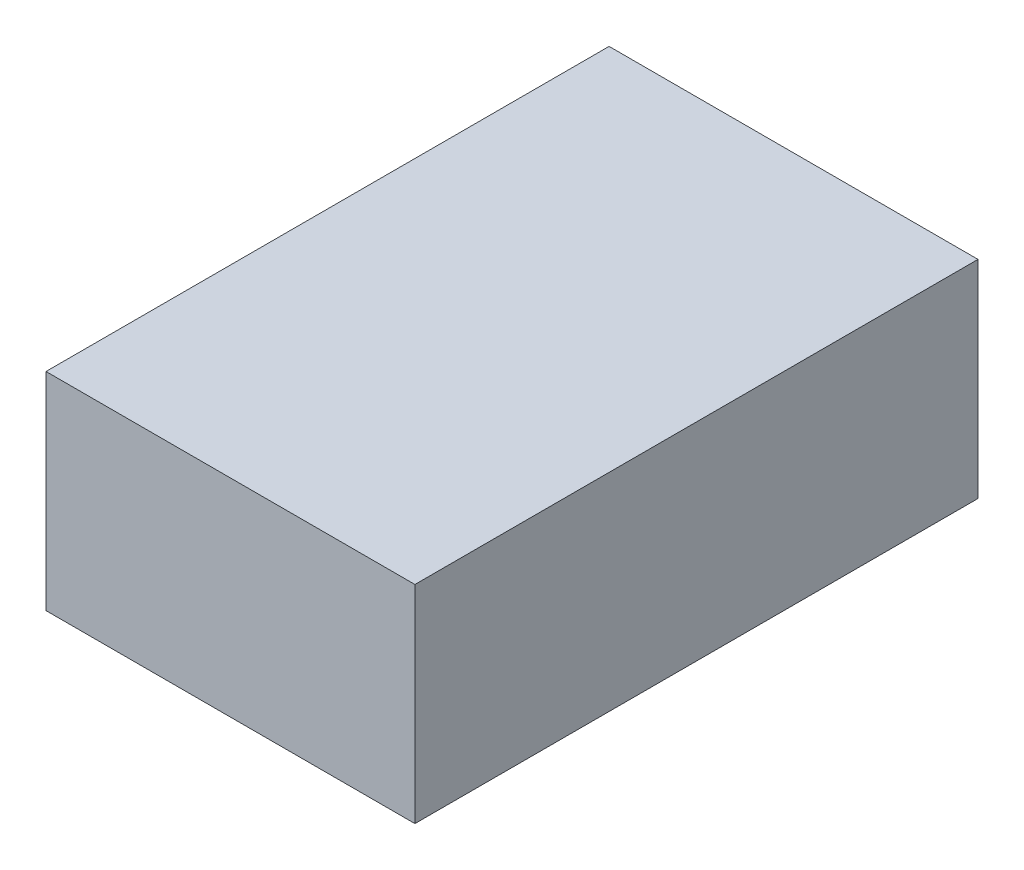
ISO-10303-21;
HEADER;
FILE_DESCRIPTION(('STEP AP214'),'2;1');
FILE_NAME('part.step','',(''),(''),'','','');
FILE_SCHEMA(('AUTOMOTIVE_DESIGN { 1 0 10303 214 1 1 1 1 }'));
ENDSEC;
DATA;
#1=APPLICATION_CONTEXT('core data for automotive mechanical design processes');
#2=APPLICATION_PROTOCOL_DEFINITION('international standard','automotive_design',2000,#1);
#3=PRODUCT_CONTEXT('',#1,'mechanical');
#4=PRODUCT('Part','Part','',(#3));
#5=PRODUCT_RELATED_PRODUCT_CATEGORY('part','',(#4));
#6=PRODUCT_DEFINITION_FORMATION('','',#4);
#7=PRODUCT_DEFINITION_CONTEXT('part definition',#1,'design');
#8=PRODUCT_DEFINITION('design','',#6,#7);
#9=PRODUCT_DEFINITION_SHAPE('','',#8);
#10=(LENGTH_UNIT() NAMED_UNIT(*) SI_UNIT(.MILLI.,.METRE.));
#11=(NAMED_UNIT(*) PLANE_ANGLE_UNIT() SI_UNIT($,.RADIAN.));
#12=(NAMED_UNIT(*) SI_UNIT($,.STERADIAN.) SOLID_ANGLE_UNIT());
#13=UNCERTAINTY_MEASURE_WITH_UNIT(LENGTH_MEASURE(1.E-05),#10,'distance_accuracy_value','');
#14=(GEOMETRIC_REPRESENTATION_CONTEXT(3) GLOBAL_UNCERTAINTY_ASSIGNED_CONTEXT((#13)) GLOBAL_UNIT_ASSIGNED_CONTEXT((#10,
#11,#12)) REPRESENTATION_CONTEXT('',''));
#15=CARTESIAN_POINT('',(0.,0.,0.));
#16=DIRECTION('',(0.,0.,1.));
#17=DIRECTION('',(1.,0.,0.));
#18=AXIS2_PLACEMENT_3D('',#15,#16,#17);
#19=CARTESIAN_POINT('',(180.43787804642,76.2,280.719307320076));
#20=DIRECTION('',(0.,0.,-1.));
#21=DIRECTION('',(-1.,0.,0.));
#22=AXIS2_PLACEMENT_3D('',#19,#20,#21);
#23=PLANE('',#22);
#24=DIRECTION('',(1.,0.,0.));
#25=VECTOR('',#24,1.);
#26=CARTESIAN_POINT('',(180.43787804642,-2.54,280.719307320076));
#27=LINE('',#26,#25);
#28=CARTESIAN_POINT('',(177.89787804642,-2.54,280.719307320076));
#29=VERTEX_POINT('',#28);
#30=CARTESIAN_POINT('',(322.67787804642,-2.54,280.719307320076));
#31=VERTEX_POINT('',#30);
#32=EDGE_CURVE('E196',#29,#31,#27,.T.);
#33=ORIENTED_EDGE('',*,*,#32,.T.);
#34=DIRECTION('',(0.,-1.,0.));
#35=VECTOR('',#34,1.);
#36=CARTESIAN_POINT('',(322.67787804642,76.2,280.719307320076));
#37=LINE('',#36,#35);
#38=CARTESIAN_POINT('',(322.67787804642,78.74,280.719307320076));
#39=VERTEX_POINT('',#38);
#40=EDGE_CURVE('E144',#39,#31,#37,.T.);
#41=ORIENTED_EDGE('',*,*,#40,.F.);
#42=DIRECTION('',(1.,0.,0.));
#43=VECTOR('',#42,1.);
#44=CARTESIAN_POINT('',(180.43787804642,78.74,280.719307320076));
#45=LINE('',#44,#43);
#46=CARTESIAN_POINT('',(177.89787804642,78.74,280.719307320076));
#47=VERTEX_POINT('',#46);
#48=EDGE_CURVE('E130',#47,#39,#45,.T.);
#49=ORIENTED_EDGE('',*,*,#48,.F.);
#50=DIRECTION('',(0.,-1.,0.));
#51=VECTOR('',#50,1.);
#52=CARTESIAN_POINT('',(177.89787804642,76.2,280.719307320076));
#53=LINE('',#52,#51);
#54=EDGE_CURVE('E104',#47,#29,#53,.T.);
#55=ORIENTED_EDGE('',*,*,#54,.T.);
#56=EDGE_LOOP('',(#33,#41,#49,#55));
#57=FACE_BOUND('',#56,.T.);
#58=ADVANCED_FACE('F44',(#57),#23,.F.);
#59=CARTESIAN_POINT('',(322.67787804642,76.2,278.179307320076));
#60=DIRECTION('',(-1.,0.,0.));
#61=DIRECTION('',(0.,0.,1.));
#62=AXIS2_PLACEMENT_3D('',#59,#60,#61);
#63=PLANE('',#62);
#64=DIRECTION('',(0.,0.,-1.));
#65=VECTOR('',#64,1.);
#66=CARTESIAN_POINT('',(322.67787804642,-2.54,278.179307320076));
#67=LINE('',#66,#65);
#68=CARTESIAN_POINT('',(322.67787804642,-2.54,59.7393073200764));
#69=VERTEX_POINT('',#68);
#70=EDGE_CURVE('E139',#31,#69,#67,.T.);
#71=ORIENTED_EDGE('',*,*,#70,.T.);
#72=DIRECTION('',(0.,-1.,0.));
#73=VECTOR('',#72,1.);
#74=CARTESIAN_POINT('',(322.67787804642,76.2,59.7393073200765));
#75=LINE('',#74,#73);
#76=CARTESIAN_POINT('',(322.67787804642,78.74,59.7393073200764));
#77=VERTEX_POINT('',#76);
#78=EDGE_CURVE('E137',#77,#69,#75,.T.);
#79=ORIENTED_EDGE('',*,*,#78,.F.);
#80=DIRECTION('',(0.,0.,-1.));
#81=VECTOR('',#80,1.);
#82=CARTESIAN_POINT('',(322.67787804642,78.74,278.179307320076));
#83=LINE('',#82,#81);
#84=EDGE_CURVE('E124',#39,#77,#83,.T.);
#85=ORIENTED_EDGE('',*,*,#84,.F.);
#86=ORIENTED_EDGE('',*,*,#40,.T.);
#87=EDGE_LOOP('',(#71,#79,#85,#86));
#88=FACE_BOUND('',#87,.T.);
#89=ADVANCED_FACE('F138',(#88),#63,.F.);
#90=CARTESIAN_POINT('',(180.43787804642,76.2,59.7393073200764));
#91=DIRECTION('',(0.,0.,-1.));
#92=DIRECTION('',(-1.,0.,0.));
#93=AXIS2_PLACEMENT_3D('',#90,#91,#92);
#94=PLANE('',#93);
#95=DIRECTION('',(1.,0.,0.));
#96=VECTOR('',#95,1.);
#97=CARTESIAN_POINT('',(180.43787804642,-2.54,59.7393073200764));
#98=LINE('',#97,#96);
#99=CARTESIAN_POINT('',(177.89787804642,-2.54,59.7393073200764));
#100=VERTEX_POINT('',#99);
#101=EDGE_CURVE('E160',#100,#69,#98,.T.);
#102=ORIENTED_EDGE('',*,*,#101,.F.);
#103=DIRECTION('',(0.,-1.,0.));
#104=VECTOR('',#103,1.);
#105=CARTESIAN_POINT('',(177.89787804642,76.2,59.7393073200764));
#106=LINE('',#105,#104);
#107=CARTESIAN_POINT('',(177.89787804642,78.74,59.7393073200764));
#108=VERTEX_POINT('',#107);
#109=EDGE_CURVE('E145',#108,#100,#106,.T.);
#110=ORIENTED_EDGE('',*,*,#109,.F.);
#111=DIRECTION('',(1.,0.,0.));
#112=VECTOR('',#111,1.);
#113=CARTESIAN_POINT('',(180.43787804642,78.74,59.7393073200764));
#114=LINE('',#113,#112);
#115=EDGE_CURVE('E129',#108,#77,#114,.T.);
#116=ORIENTED_EDGE('',*,*,#115,.T.);
#117=ORIENTED_EDGE('',*,*,#78,.T.);
#118=EDGE_LOOP('',(#102,#110,#116,#117));
#119=FACE_BOUND('',#118,.T.);
#120=ADVANCED_FACE('F147',(#119),#94,.T.);
#121=CARTESIAN_POINT('',(177.89787804642,76.2,278.179307320076));
#122=DIRECTION('',(-1.,0.,0.));
#123=DIRECTION('',(0.,0.,1.));
#124=AXIS2_PLACEMENT_3D('',#121,#122,#123);
#125=PLANE('',#124);
#126=DIRECTION('',(0.,0.,-1.));
#127=VECTOR('',#126,1.);
#128=CARTESIAN_POINT('',(177.89787804642,-2.54,278.179307320076));
#129=LINE('',#128,#127);
#130=EDGE_CURVE('E157',#29,#100,#129,.T.);
#131=ORIENTED_EDGE('',*,*,#130,.F.);
#132=ORIENTED_EDGE('',*,*,#54,.F.);
#133=DIRECTION('',(0.,0.,-1.));
#134=VECTOR('',#133,1.);
#135=CARTESIAN_POINT('',(177.89787804642,78.74,278.179307320076));
#136=LINE('',#135,#134);
#137=EDGE_CURVE('E150',#47,#108,#136,.T.);
#138=ORIENTED_EDGE('',*,*,#137,.T.);
#139=ORIENTED_EDGE('',*,*,#109,.T.);
#140=EDGE_LOOP('',(#131,#132,#138,#139));
#141=FACE_BOUND('',#140,.T.);
#142=ADVANCED_FACE('F208',(#141),#125,.T.);
#143=CARTESIAN_POINT('',(0.,78.74,0.));
#144=DIRECTION('',(0.,1.,0.));
#145=DIRECTION('',(0.,0.,1.));
#146=AXIS2_PLACEMENT_3D('',#143,#144,#145);
#147=PLANE('',#146);
#148=ORIENTED_EDGE('',*,*,#48,.T.);
#149=ORIENTED_EDGE('',*,*,#84,.T.);
#150=ORIENTED_EDGE('',*,*,#115,.F.);
#151=ORIENTED_EDGE('',*,*,#137,.F.);
#152=EDGE_LOOP('',(#148,#149,#150,#151));
#153=FACE_BOUND('',#152,.T.);
#154=ADVANCED_FACE('F126',(#153),#147,.T.);
#155=CARTESIAN_POINT('',(0.,-2.54,0.));
#156=DIRECTION('',(0.,1.,0.));
#157=DIRECTION('',(0.,0.,1.));
#158=AXIS2_PLACEMENT_3D('',#155,#156,#157);
#159=PLANE('',#158);
#160=ORIENTED_EDGE('',*,*,#32,.F.);
#161=ORIENTED_EDGE('',*,*,#130,.T.);
#162=ORIENTED_EDGE('',*,*,#101,.T.);
#163=ORIENTED_EDGE('',*,*,#70,.F.);
#164=EDGE_LOOP('',(#160,#161,#162,#163));
#165=FACE_BOUND('',#164,.T.);
#166=ADVANCED_FACE('F205',(#165),#159,.F.);
#167=CLOSED_SHELL('',(#58,#89,#120,#142,#154,#166));
#168=CARTESIAN_POINT('',(180.43787804642,76.2,278.179307320076));
#169=DIRECTION('',(0.,0.,-1.));
#170=DIRECTION('',(-1.,0.,0.));
#171=AXIS2_PLACEMENT_3D('',#168,#169,#170);
#172=PLANE('',#171);
#173=DIRECTION('',(1.,0.,0.));
#174=VECTOR('',#173,1.);
#175=CARTESIAN_POINT('',(180.43787804642,0.,278.179307320076));
#176=LINE('',#175,#174);
#177=CARTESIAN_POINT('',(180.43787804642,0.,278.179307320076));
#178=VERTEX_POINT('',#177);
#179=CARTESIAN_POINT('',(320.13787804642,0.,278.179307320076));
#180=VERTEX_POINT('',#179);
#181=EDGE_CURVE('E48',#178,#180,#176,.T.);
#182=ORIENTED_EDGE('',*,*,#181,.F.);
#183=DIRECTION('',(0.,-1.,0.));
#184=VECTOR('',#183,1.);
#185=CARTESIAN_POINT('',(180.43787804642,76.2,278.179307320076));
#186=LINE('',#185,#184);
#187=CARTESIAN_POINT('',(180.43787804642,76.2,278.179307320076));
#188=VERTEX_POINT('',#187);
#189=EDGE_CURVE('E95',#188,#178,#186,.T.);
#190=ORIENTED_EDGE('',*,*,#189,.F.);
#191=DIRECTION('',(1.,0.,0.));
#192=VECTOR('',#191,1.);
#193=CARTESIAN_POINT('',(180.43787804642,76.2,278.179307320076));
#194=LINE('',#193,#192);
#195=CARTESIAN_POINT('',(320.13787804642,76.2,278.179307320076));
#196=VERTEX_POINT('',#195);
#197=EDGE_CURVE('E166',#188,#196,#194,.T.);
#198=ORIENTED_EDGE('',*,*,#197,.T.);
#199=DIRECTION('',(0.,-1.,0.));
#200=VECTOR('',#199,1.);
#201=CARTESIAN_POINT('',(320.13787804642,76.2,278.179307320076));
#202=LINE('',#201,#200);
#203=EDGE_CURVE('E182',#196,#180,#202,.T.);
#204=ORIENTED_EDGE('',*,*,#203,.T.);
#205=EDGE_LOOP('',(#182,#190,#198,#204));
#206=FACE_BOUND('',#205,.T.);
#207=ADVANCED_FACE('F253',(#206),#172,.T.);
#208=CARTESIAN_POINT('',(320.13787804642,76.2,278.179307320076));
#209=DIRECTION('',(-1.,0.,0.));
#210=DIRECTION('',(0.,0.,1.));
#211=AXIS2_PLACEMENT_3D('',#208,#209,#210);
#212=PLANE('',#211);
#213=DIRECTION('',(0.,0.,-1.));
#214=VECTOR('',#213,1.);
#215=CARTESIAN_POINT('',(320.13787804642,0.,278.179307320076));
#216=LINE('',#215,#214);
#217=CARTESIAN_POINT('',(320.13787804642,0.,62.2793073200764));
#218=VERTEX_POINT('',#217);
#219=EDGE_CURVE('E65',#180,#218,#216,.T.);
#220=ORIENTED_EDGE('',*,*,#219,.F.);
#221=ORIENTED_EDGE('',*,*,#203,.F.);
#222=DIRECTION('',(0.,0.,-1.));
#223=VECTOR('',#222,1.);
#224=CARTESIAN_POINT('',(320.13787804642,76.2,278.179307320076));
#225=LINE('',#224,#223);
#226=CARTESIAN_POINT('',(320.13787804642,76.2,62.2793073200764));
#227=VERTEX_POINT('',#226);
#228=EDGE_CURVE('E88',#196,#227,#225,.T.);
#229=ORIENTED_EDGE('',*,*,#228,.T.);
#230=DIRECTION('',(0.,-1.,0.));
#231=VECTOR('',#230,1.);
#232=CARTESIAN_POINT('',(320.13787804642,76.2,62.2793073200764));
#233=LINE('',#232,#231);
#234=EDGE_CURVE('E176',#227,#218,#233,.T.);
#235=ORIENTED_EDGE('',*,*,#234,.T.);
#236=EDGE_LOOP('',(#220,#221,#229,#235));
#237=FACE_BOUND('',#236,.T.);
#238=ADVANCED_FACE('F257',(#237),#212,.T.);
#239=CARTESIAN_POINT('',(180.43787804642,76.2,62.2793073200764));
#240=DIRECTION('',(0.,0.,-1.));
#241=DIRECTION('',(-1.,0.,0.));
#242=AXIS2_PLACEMENT_3D('',#239,#240,#241);
#243=PLANE('',#242);
#244=DIRECTION('',(1.,0.,0.));
#245=VECTOR('',#244,1.);
#246=CARTESIAN_POINT('',(180.43787804642,0.,62.2793073200764));
#247=LINE('',#246,#245);
#248=CARTESIAN_POINT('',(180.43787804642,0.,62.2793073200764));
#249=VERTEX_POINT('',#248);
#250=EDGE_CURVE('E11',#249,#218,#247,.T.);
#251=ORIENTED_EDGE('',*,*,#250,.T.);
#252=ORIENTED_EDGE('',*,*,#234,.F.);
#253=DIRECTION('',(1.,0.,0.));
#254=VECTOR('',#253,1.);
#255=CARTESIAN_POINT('',(180.43787804642,76.2,62.2793073200764));
#256=LINE('',#255,#254);
#257=CARTESIAN_POINT('',(180.43787804642,76.2,62.2793073200764));
#258=VERTEX_POINT('',#257);
#259=EDGE_CURVE('E179',#258,#227,#256,.T.);
#260=ORIENTED_EDGE('',*,*,#259,.F.);
#261=DIRECTION('',(0.,-1.,0.));
#262=VECTOR('',#261,1.);
#263=CARTESIAN_POINT('',(180.43787804642,76.2,62.2793073200764));
#264=LINE('',#263,#262);
#265=EDGE_CURVE('E169',#258,#249,#264,.T.);
#266=ORIENTED_EDGE('',*,*,#265,.T.);
#267=EDGE_LOOP('',(#251,#252,#260,#266));
#268=FACE_BOUND('',#267,.T.);
#269=ADVANCED_FACE('F268',(#268),#243,.F.);
#270=CARTESIAN_POINT('',(180.43787804642,76.2,278.179307320076));
#271=DIRECTION('',(-1.,0.,0.));
#272=DIRECTION('',(0.,0.,1.));
#273=AXIS2_PLACEMENT_3D('',#270,#271,#272);
#274=PLANE('',#273);
#275=DIRECTION('',(0.,0.,-1.));
#276=VECTOR('',#275,1.);
#277=CARTESIAN_POINT('',(180.43787804642,0.,278.179307320076));
#278=LINE('',#277,#276);
#279=EDGE_CURVE('E56',#178,#249,#278,.T.);
#280=ORIENTED_EDGE('',*,*,#279,.T.);
#281=ORIENTED_EDGE('',*,*,#265,.F.);
#282=DIRECTION('',(0.,0.,-1.));
#283=VECTOR('',#282,1.);
#284=CARTESIAN_POINT('',(180.43787804642,76.2,278.179307320076));
#285=LINE('',#284,#283);
#286=EDGE_CURVE('E172',#188,#258,#285,.T.);
#287=ORIENTED_EDGE('',*,*,#286,.F.);
#288=ORIENTED_EDGE('',*,*,#189,.T.);
#289=EDGE_LOOP('',(#280,#281,#287,#288));
#290=FACE_BOUND('',#289,.T.);
#291=ADVANCED_FACE('F277',(#290),#274,.F.);
#292=CARTESIAN_POINT('',(0.,76.2,0.));
#293=DIRECTION('',(0.,1.,0.));
#294=DIRECTION('',(0.,0.,1.));
#295=AXIS2_PLACEMENT_3D('',#292,#293,#294);
#296=PLANE('',#295);
#297=ORIENTED_EDGE('',*,*,#197,.F.);
#298=ORIENTED_EDGE('',*,*,#286,.T.);
#299=ORIENTED_EDGE('',*,*,#259,.T.);
#300=ORIENTED_EDGE('',*,*,#228,.F.);
#301=EDGE_LOOP('',(#297,#298,#299,#300));
#302=FACE_BOUND('',#301,.T.);
#303=ADVANCED_FACE('F287',(#302),#296,.F.);
#304=CARTESIAN_POINT('',(0.,0.,0.));
#305=DIRECTION('',(0.,1.,0.));
#306=DIRECTION('',(0.,0.,1.));
#307=AXIS2_PLACEMENT_3D('',#304,#305,#306);
#308=PLANE('',#307);
#309=ORIENTED_EDGE('',*,*,#181,.T.);
#310=ORIENTED_EDGE('',*,*,#219,.T.);
#311=ORIENTED_EDGE('',*,*,#250,.F.);
#312=ORIENTED_EDGE('',*,*,#279,.F.);
#313=EDGE_LOOP('',(#309,#310,#311,#312));
#314=FACE_BOUND('',#313,.T.);
#315=ADVANCED_FACE('F46',(#314),#308,.T.);
#316=CLOSED_SHELL('',(#207,#238,#269,#291,#303,#315));
#317=ORIENTED_CLOSED_SHELL('',*,#316,.T.);
#318=BREP_WITH_VOIDS('B2',#167,(#317));
#319=ADVANCED_BREP_SHAPE_REPRESENTATION('',(#18,#318),#14);
#320=SHAPE_DEFINITION_REPRESENTATION(#9,#319);
ENDSEC;
END-ISO-10303-21;
